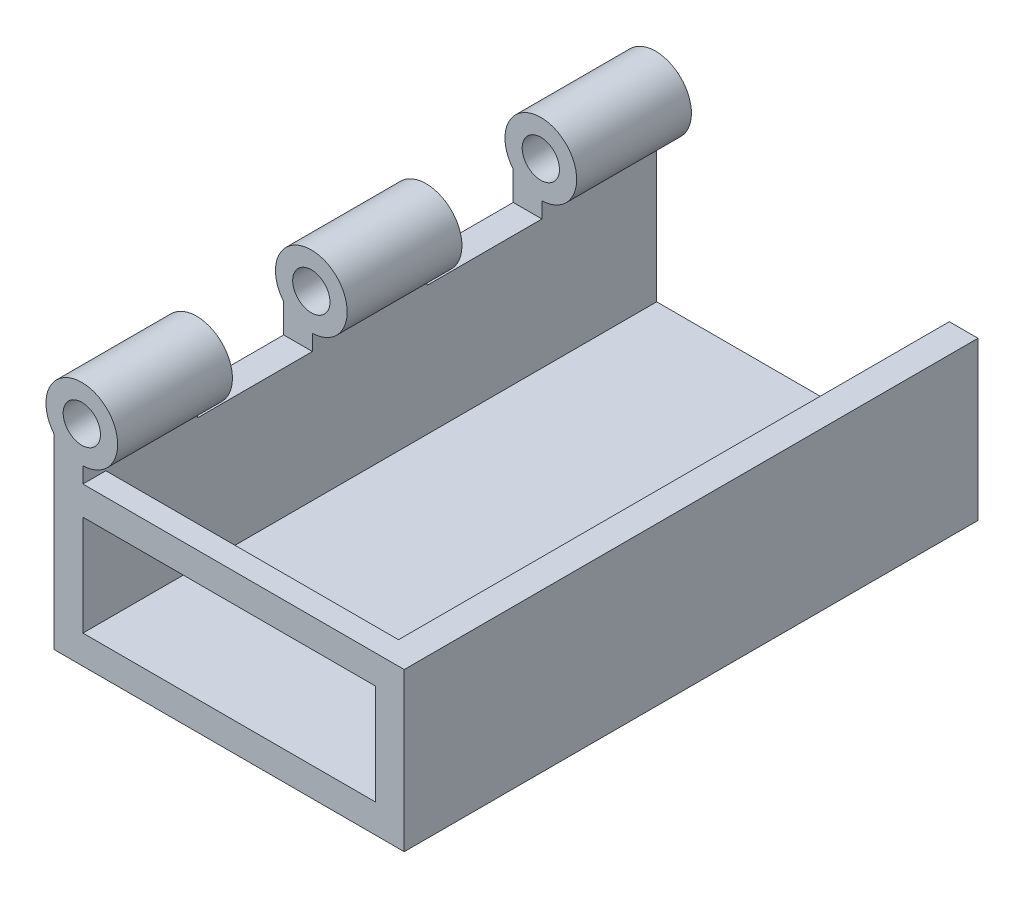
ISO-10303-21;
HEADER;
FILE_DESCRIPTION(('STEP AP214'),'2;1');
FILE_NAME('part.step','',(''),(''),'','','');
FILE_SCHEMA(('AUTOMOTIVE_DESIGN { 1 0 10303 214 1 1 1 1 }'));
ENDSEC;
DATA;
#1=APPLICATION_CONTEXT('core data for automotive mechanical design processes');
#2=APPLICATION_PROTOCOL_DEFINITION('international standard','automotive_design',2000,#1);
#3=PRODUCT_CONTEXT('',#1,'mechanical');
#4=PRODUCT('Part','Part','',(#3));
#5=PRODUCT_RELATED_PRODUCT_CATEGORY('part','',(#4));
#6=PRODUCT_DEFINITION_FORMATION('','',#4);
#7=PRODUCT_DEFINITION_CONTEXT('part definition',#1,'design');
#8=PRODUCT_DEFINITION('design','',#6,#7);
#9=PRODUCT_DEFINITION_SHAPE('','',#8);
#10=(LENGTH_UNIT() NAMED_UNIT(*) SI_UNIT(.MILLI.,.METRE.));
#11=(NAMED_UNIT(*) PLANE_ANGLE_UNIT() SI_UNIT($,.RADIAN.));
#12=(NAMED_UNIT(*) SI_UNIT($,.STERADIAN.) SOLID_ANGLE_UNIT());
#13=UNCERTAINTY_MEASURE_WITH_UNIT(LENGTH_MEASURE(1.E-05),#10,'distance_accuracy_value','');
#14=(GEOMETRIC_REPRESENTATION_CONTEXT(3) GLOBAL_UNCERTAINTY_ASSIGNED_CONTEXT((#13)) GLOBAL_UNIT_ASSIGNED_CONTEXT((#10,
#11,#12)) REPRESENTATION_CONTEXT('',''));
#15=CARTESIAN_POINT('',(0.,0.,0.));
#16=DIRECTION('',(0.,0.,1.));
#17=DIRECTION('',(1.,0.,0.));
#18=AXIS2_PLACEMENT_3D('',#15,#16,#17);
#19=CARTESIAN_POINT('',(0.,13.97,0.));
#20=DIRECTION('',(0.,1.,0.));
#21=DIRECTION('',(0.,0.,1.));
#22=AXIS2_PLACEMENT_3D('',#19,#20,#21);
#23=PLANE('',#22);
#24=DIRECTION('',(-1.,0.,0.));
#25=VECTOR('',#24,1.);
#26=CARTESIAN_POINT('',(0.,13.97,-14.224));
#27=LINE('',#26,#25);
#28=CARTESIAN_POINT('',(-12.954,13.97,-14.224));
#29=VERTEX_POINT('',#28);
#30=CARTESIAN_POINT('',(-15.494,13.97,-14.224));
#31=VERTEX_POINT('',#30);
#32=EDGE_CURVE('E214',#29,#31,#27,.T.);
#33=ORIENTED_EDGE('',*,*,#32,.T.);
#34=DIRECTION('',(0.,0.,1.));
#35=VECTOR('',#34,1.);
#36=CARTESIAN_POINT('',(-15.494,13.97,0.));
#37=LINE('',#36,#35);
#38=CARTESIAN_POINT('',(-15.494,13.97,-4.06400000000001));
#39=VERTEX_POINT('',#38);
#40=EDGE_CURVE('E363',#31,#39,#37,.T.);
#41=ORIENTED_EDGE('',*,*,#40,.T.);
#42=DIRECTION('',(-1.,0.,0.));
#43=VECTOR('',#42,1.);
#44=CARTESIAN_POINT('',(0.,13.97,-4.06400000000001));
#45=LINE('',#44,#43);
#46=CARTESIAN_POINT('',(-12.954,13.97,-4.06400000000001));
#47=VERTEX_POINT('',#46);
#48=EDGE_CURVE('E243',#47,#39,#45,.T.);
#49=ORIENTED_EDGE('',*,*,#48,.F.);
#50=DIRECTION('',(0.,0.,1.));
#51=VECTOR('',#50,1.);
#52=CARTESIAN_POINT('',(-12.954,13.97,0.));
#53=LINE('',#52,#51);
#54=EDGE_CURVE('E58',#29,#47,#53,.T.);
#55=ORIENTED_EDGE('',*,*,#54,.F.);
#56=EDGE_LOOP('',(#33,#41,#49,#55));
#57=FACE_BOUND('',#56,.T.);
#58=ADVANCED_FACE('F41',(#57),#23,.T.);
#59=DIRECTION('',(1.,0.,0.));
#60=VECTOR('',#59,1.);
#61=CARTESIAN_POINT('',(0.,13.97,24.384));
#62=LINE('',#61,#60);
#63=CARTESIAN_POINT('',(-12.954,13.97,24.384));
#64=VERTEX_POINT('',#63);
#65=CARTESIAN_POINT('',(12.954,13.97,24.384));
#66=VERTEX_POINT('',#65);
#67=EDGE_CURVE('E355',#64,#66,#62,.T.);
#68=ORIENTED_EDGE('',*,*,#67,.F.);
#69=DIRECTION('',(0.,0.,1.));
#70=VECTOR('',#69,1.);
#71=CARTESIAN_POINT('',(-12.954,13.97,16.256));
#72=LINE('',#71,#70);
#73=CARTESIAN_POINT('',(-12.954,13.97,26.416));
#74=VERTEX_POINT('',#73);
#75=EDGE_CURVE('E11',#64,#74,#72,.T.);
#76=ORIENTED_EDGE('',*,*,#75,.T.);
#77=DIRECTION('',(1.,0.,0.));
#78=VECTOR('',#77,1.);
#79=CARTESIAN_POINT('',(0.,13.97,26.416));
#80=LINE('',#79,#78);
#81=CARTESIAN_POINT('',(15.494,13.97,26.416));
#82=VERTEX_POINT('',#81);
#83=EDGE_CURVE('E366',#74,#82,#80,.T.);
#84=ORIENTED_EDGE('',*,*,#83,.T.);
#85=DIRECTION('',(0.,0.,-1.));
#86=VECTOR('',#85,1.);
#87=CARTESIAN_POINT('',(15.494,13.97,0.));
#88=LINE('',#87,#86);
#89=CARTESIAN_POINT('',(15.494,13.97,-24.384));
#90=VERTEX_POINT('',#89);
#91=EDGE_CURVE('E344',#82,#90,#88,.T.);
#92=ORIENTED_EDGE('',*,*,#91,.T.);
#93=DIRECTION('',(-1.,0.,0.));
#94=VECTOR('',#93,1.);
#95=CARTESIAN_POINT('',(0.,13.97,-24.384));
#96=LINE('',#95,#94);
#97=CARTESIAN_POINT('',(12.954,13.97,-24.384));
#98=VERTEX_POINT('',#97);
#99=EDGE_CURVE('E348',#90,#98,#96,.T.);
#100=ORIENTED_EDGE('',*,*,#99,.T.);
#101=DIRECTION('',(0.,0.,1.));
#102=VECTOR('',#101,1.);
#103=CARTESIAN_POINT('',(12.954,13.97,0.));
#104=LINE('',#103,#102);
#105=EDGE_CURVE('E352',#98,#66,#104,.T.);
#106=ORIENTED_EDGE('',*,*,#105,.T.);
#107=EDGE_LOOP('',(#68,#76,#84,#92,#100,#106));
#108=FACE_BOUND('',#107,.T.);
#109=ADVANCED_FACE('F465',(#108),#23,.T.);
#110=CARTESIAN_POINT('',(12.954,13.97,0.));
#111=DIRECTION('',(1.,0.,0.));
#112=DIRECTION('',(0.,0.,-1.));
#113=AXIS2_PLACEMENT_3D('',#110,#111,#112);
#114=PLANE('',#113);
#115=DIRECTION('',(0.,0.,1.));
#116=VECTOR('',#115,1.);
#117=CARTESIAN_POINT('',(12.954,11.43,23.876));
#118=LINE('',#117,#116);
#119=CARTESIAN_POINT('',(12.954,11.43,24.384));
#120=VERTEX_POINT('',#119);
#121=CARTESIAN_POINT('',(12.954,11.43,26.416));
#122=VERTEX_POINT('',#121);
#123=EDGE_CURVE('E325',#120,#122,#118,.T.);
#124=ORIENTED_EDGE('',*,*,#123,.F.);
#125=DIRECTION('',(0.,-1.,0.));
#126=VECTOR('',#125,1.);
#127=CARTESIAN_POINT('',(12.954,13.97,24.384));
#128=LINE('',#127,#126);
#129=EDGE_CURVE('E392',#66,#120,#128,.T.);
#130=ORIENTED_EDGE('',*,*,#129,.F.);
#131=ORIENTED_EDGE('',*,*,#105,.F.);
#132=DIRECTION('',(0.,-1.,0.));
#133=VECTOR('',#132,1.);
#134=CARTESIAN_POINT('',(12.954,13.97,-24.384));
#135=LINE('',#134,#133);
#136=CARTESIAN_POINT('',(12.954,2.54,-24.384));
#137=VERTEX_POINT('',#136);
#138=EDGE_CURVE('E395',#98,#137,#135,.T.);
#139=ORIENTED_EDGE('',*,*,#138,.T.);
#140=DIRECTION('',(0.,0.,1.));
#141=VECTOR('',#140,1.);
#142=CARTESIAN_POINT('',(12.954,2.54,-24.384));
#143=LINE('',#142,#141);
#144=CARTESIAN_POINT('',(12.954,2.54,26.416));
#145=VERTEX_POINT('',#144);
#146=EDGE_CURVE('E338',#137,#145,#143,.T.);
#147=ORIENTED_EDGE('',*,*,#146,.T.);
#148=DIRECTION('',(0.,1.,0.));
#149=VECTOR('',#148,1.);
#150=CARTESIAN_POINT('',(12.954,11.43,26.416));
#151=LINE('',#150,#149);
#152=EDGE_CURVE('E309',#145,#122,#151,.T.);
#153=ORIENTED_EDGE('',*,*,#152,.T.);
#154=EDGE_LOOP('',(#124,#130,#131,#139,#147,#153));
#155=FACE_BOUND('',#154,.T.);
#156=ADVANCED_FACE('F472',(#155),#114,.F.);
#157=CARTESIAN_POINT('',(0.,13.97,24.384));
#158=DIRECTION('',(0.,0.,-1.));
#159=DIRECTION('',(-1.,0.,0.));
#160=AXIS2_PLACEMENT_3D('',#157,#158,#159);
#161=PLANE('',#160);
#162=DIRECTION('',(1.,0.,0.));
#163=VECTOR('',#162,1.);
#164=CARTESIAN_POINT('',(0.,11.43,24.384));
#165=LINE('',#164,#163);
#166=CARTESIAN_POINT('',(-12.954,11.43,24.384));
#167=VERTEX_POINT('',#166);
#168=EDGE_CURVE('E329',#167,#120,#165,.T.);
#169=ORIENTED_EDGE('',*,*,#168,.F.);
#170=DIRECTION('',(0.,-1.,0.));
#171=VECTOR('',#170,1.);
#172=CARTESIAN_POINT('',(-12.954,13.97,24.384));
#173=LINE('',#172,#171);
#174=EDGE_CURVE('E188',#64,#167,#173,.T.);
#175=ORIENTED_EDGE('',*,*,#174,.F.);
#176=ORIENTED_EDGE('',*,*,#67,.T.);
#177=ORIENTED_EDGE('',*,*,#129,.T.);
#178=EDGE_LOOP('',(#169,#175,#176,#177));
#179=FACE_BOUND('',#178,.T.);
#180=ADVANCED_FACE('F497',(#179),#161,.T.);
#181=CARTESIAN_POINT('',(-12.954,13.97,0.));
#182=DIRECTION('',(1.,0.,0.));
#183=DIRECTION('',(0.,0.,-1.));
#184=AXIS2_PLACEMENT_3D('',#181,#182,#183);
#185=PLANE('',#184);
#186=ORIENTED_EDGE('',*,*,#174,.T.);
#187=DIRECTION('',(0.,0.,1.));
#188=VECTOR('',#187,1.);
#189=CARTESIAN_POINT('',(-12.954,11.43,23.876));
#190=LINE('',#189,#188);
#191=CARTESIAN_POINT('',(-12.954,11.43,26.416));
#192=VERTEX_POINT('',#191);
#193=EDGE_CURVE('E326',#167,#192,#190,.T.);
#194=ORIENTED_EDGE('',*,*,#193,.T.);
#195=DIRECTION('',(0.,-1.,0.));
#196=VECTOR('',#195,1.);
#197=CARTESIAN_POINT('',(-12.954,11.43,26.416));
#198=LINE('',#197,#196);
#199=CARTESIAN_POINT('',(-12.954,2.54,26.416));
#200=VERTEX_POINT('',#199);
#201=EDGE_CURVE('E318',#192,#200,#198,.T.);
#202=ORIENTED_EDGE('',*,*,#201,.T.);
#203=DIRECTION('',(0.,0.,1.));
#204=VECTOR('',#203,1.);
#205=CARTESIAN_POINT('',(-12.954,2.54,-24.384));
#206=LINE('',#205,#204);
#207=CARTESIAN_POINT('',(-12.954,2.54,-24.384));
#208=VERTEX_POINT('',#207);
#209=EDGE_CURVE('E182',#208,#200,#206,.T.);
#210=ORIENTED_EDGE('',*,*,#209,.F.);
#211=DIRECTION('',(0.,-1.,0.));
#212=VECTOR('',#211,1.);
#213=CARTESIAN_POINT('',(-12.954,13.97,-24.384));
#214=LINE('',#213,#212);
#215=CARTESIAN_POINT('',(-12.954,15.3661408239153,-24.384));
#216=VERTEX_POINT('',#215);
#217=EDGE_CURVE('E174',#216,#208,#214,.T.);
#218=ORIENTED_EDGE('',*,*,#217,.F.);
#219=DIRECTION('',(0.,0.,1.));
#220=VECTOR('',#219,1.);
#221=CARTESIAN_POINT('',(-12.954,15.3661408239153,-24.384));
#222=LINE('',#221,#220);
#223=CARTESIAN_POINT('',(-12.954,15.3661408239153,-14.224));
#224=VERTEX_POINT('',#223);
#225=EDGE_CURVE('E179',#216,#224,#222,.T.);
#226=ORIENTED_EDGE('',*,*,#225,.T.);
#227=DIRECTION('',(0.,1.,0.));
#228=VECTOR('',#227,1.);
#229=CARTESIAN_POINT('',(-12.954,0.,-14.224));
#230=LINE('',#229,#228);
#231=EDGE_CURVE('E217',#29,#224,#230,.T.);
#232=ORIENTED_EDGE('',*,*,#231,.F.);
#233=ORIENTED_EDGE('',*,*,#54,.T.);
#234=DIRECTION('',(0.,1.,0.));
#235=VECTOR('',#234,1.);
#236=CARTESIAN_POINT('',(-12.954,0.,-4.06400000000001));
#237=LINE('',#236,#235);
#238=CARTESIAN_POINT('',(-12.954,15.3661408239153,-4.06400000000001));
#239=VERTEX_POINT('',#238);
#240=EDGE_CURVE('E231',#47,#239,#237,.T.);
#241=ORIENTED_EDGE('',*,*,#240,.T.);
#242=DIRECTION('',(0.,0.,1.));
#243=VECTOR('',#242,1.);
#244=CARTESIAN_POINT('',(-12.954,15.3661408239153,-4.06400000000001));
#245=LINE('',#244,#243);
#246=CARTESIAN_POINT('',(-12.954,15.3661408239153,6.09599999999999));
#247=VERTEX_POINT('',#246);
#248=EDGE_CURVE('E251',#239,#247,#245,.T.);
#249=ORIENTED_EDGE('',*,*,#248,.T.);
#250=DIRECTION('',(0.,1.,0.));
#251=VECTOR('',#250,1.);
#252=CARTESIAN_POINT('',(-12.954,0.,6.09599999999999));
#253=LINE('',#252,#251);
#254=CARTESIAN_POINT('',(-12.954,13.97,6.09599999999999));
#255=VERTEX_POINT('',#254);
#256=EDGE_CURVE('E229',#255,#247,#253,.T.);
#257=ORIENTED_EDGE('',*,*,#256,.F.);
#258=CARTESIAN_POINT('',(-12.954,13.97,16.256));
#259=VERTEX_POINT('',#258);
#260=EDGE_CURVE('E359',#255,#259,#53,.T.);
#261=ORIENTED_EDGE('',*,*,#260,.T.);
#262=DIRECTION('',(0.,1.,0.));
#263=VECTOR('',#262,1.);
#264=CARTESIAN_POINT('',(-12.954,0.,16.256));
#265=LINE('',#264,#263);
#266=CARTESIAN_POINT('',(-12.954,15.3661408239153,16.256));
#267=VERTEX_POINT('',#266);
#268=EDGE_CURVE('E274',#259,#267,#265,.T.);
#269=ORIENTED_EDGE('',*,*,#268,.T.);
#270=DIRECTION('',(0.,0.,1.));
#271=VECTOR('',#270,1.);
#272=CARTESIAN_POINT('',(-12.954,15.3661408239153,16.256));
#273=LINE('',#272,#271);
#274=CARTESIAN_POINT('',(-12.954,15.3661408239153,26.416));
#275=VERTEX_POINT('',#274);
#276=EDGE_CURVE('E294',#267,#275,#273,.T.);
#277=ORIENTED_EDGE('',*,*,#276,.T.);
#278=DIRECTION('',(0.,1.,0.));
#279=VECTOR('',#278,1.);
#280=CARTESIAN_POINT('',(-12.954,0.,26.416));
#281=LINE('',#280,#279);
#282=EDGE_CURVE('E271',#74,#275,#281,.T.);
#283=ORIENTED_EDGE('',*,*,#282,.F.);
#284=ORIENTED_EDGE('',*,*,#75,.F.);
#285=EDGE_LOOP('',(#186,#194,#202,#210,#218,#226,#232,#233,#241,#249,#257,#261,#269,#277,#283,#284));
#286=FACE_BOUND('',#285,.T.);
#287=ADVANCED_FACE('F177',(#286),#185,.T.);
#288=CARTESIAN_POINT('',(15.494,13.97,0.));
#289=DIRECTION('',(-1.,0.,0.));
#290=DIRECTION('',(0.,0.,1.));
#291=AXIS2_PLACEMENT_3D('',#288,#289,#290);
#292=PLANE('',#291);
#293=DIRECTION('',(0.,0.,-1.));
#294=VECTOR('',#293,1.);
#295=CARTESIAN_POINT('',(15.494,0.,0.));
#296=LINE('',#295,#294);
#297=CARTESIAN_POINT('',(15.494,0.,26.416));
#298=VERTEX_POINT('',#297);
#299=CARTESIAN_POINT('',(15.494,0.,-24.384));
#300=VERTEX_POINT('',#299);
#301=EDGE_CURVE('E343',#298,#300,#296,.T.);
#302=ORIENTED_EDGE('',*,*,#301,.T.);
#303=DIRECTION('',(0.,-1.,0.));
#304=VECTOR('',#303,1.);
#305=CARTESIAN_POINT('',(15.494,13.97,-24.384));
#306=LINE('',#305,#304);
#307=EDGE_CURVE('E45',#90,#300,#306,.T.);
#308=ORIENTED_EDGE('',*,*,#307,.F.);
#309=ORIENTED_EDGE('',*,*,#91,.F.);
#310=DIRECTION('',(0.,-1.,0.));
#311=VECTOR('',#310,1.);
#312=CARTESIAN_POINT('',(15.494,13.97,26.416));
#313=LINE('',#312,#311);
#314=EDGE_CURVE('E369',#82,#298,#313,.T.);
#315=ORIENTED_EDGE('',*,*,#314,.T.);
#316=EDGE_LOOP('',(#302,#308,#309,#315));
#317=FACE_BOUND('',#316,.T.);
#318=ADVANCED_FACE('F43',(#317),#292,.F.);
#319=CARTESIAN_POINT('',(0.,13.97,-24.384));
#320=DIRECTION('',(0.,0.,1.));
#321=DIRECTION('',(1.,0.,0.));
#322=AXIS2_PLACEMENT_3D('',#319,#320,#321);
#323=PLANE('',#322);
#324=DIRECTION('',(-1.,0.,0.));
#325=VECTOR('',#324,1.);
#326=CARTESIAN_POINT('',(0.,0.,-24.384));
#327=LINE('',#326,#325);
#328=CARTESIAN_POINT('',(-15.494,0.,-24.384));
#329=VERTEX_POINT('',#328);
#330=EDGE_CURVE('E373',#300,#329,#327,.T.);
#331=ORIENTED_EDGE('',*,*,#330,.T.);
#332=DIRECTION('',(0.,-1.,0.));
#333=VECTOR('',#332,1.);
#334=CARTESIAN_POINT('',(-15.494,13.97,-24.384));
#335=LINE('',#334,#333);
#336=CARTESIAN_POINT('',(-15.494,16.51,-24.384));
#337=VERTEX_POINT('',#336);
#338=EDGE_CURVE('E189',#337,#329,#335,.T.);
#339=ORIENTED_EDGE('',*,*,#338,.F.);
#340=CARTESIAN_POINT('',(-13.052425,18.5396148697167,-24.384));
#341=DIRECTION('',(0.,0.,1.));
#342=DIRECTION('',(1.,0.,0.));
#343=AXIS2_PLACEMENT_3D('',#340,#341,#342);
#344=CIRCLE('',#343,3.175);
#345=EDGE_CURVE('E194',#216,#337,#344,.T.);
#346=ORIENTED_EDGE('',*,*,#345,.F.);
#347=ORIENTED_EDGE('',*,*,#217,.T.);
#348=DIRECTION('',(1.,0.,0.));
#349=VECTOR('',#348,1.);
#350=CARTESIAN_POINT('',(-12.954,2.54,-24.384));
#351=LINE('',#350,#349);
#352=EDGE_CURVE('E335',#208,#137,#351,.T.);
#353=ORIENTED_EDGE('',*,*,#352,.T.);
#354=ORIENTED_EDGE('',*,*,#138,.F.);
#355=ORIENTED_EDGE('',*,*,#99,.F.);
#356=ORIENTED_EDGE('',*,*,#307,.T.);
#357=EDGE_LOOP('',(#331,#339,#346,#347,#353,#354,#355,#356));
#358=FACE_BOUND('',#357,.T.);
#359=CARTESIAN_POINT('',(-13.052425,18.5396148697167,-24.384));
#360=DIRECTION('',(0.,0.,1.));
#361=DIRECTION('',(1.,0.,0.));
#362=AXIS2_PLACEMENT_3D('',#359,#360,#361);
#363=CIRCLE('',#362,1.651);
#364=CARTESIAN_POINT('',(-11.401425,18.5396148697167,-24.384));
#365=VERTEX_POINT('',#364);
#366=EDGE_CURVE('E200',#365,#365,#363,.T.);
#367=ORIENTED_EDGE('',*,*,#366,.T.);
#368=EDGE_LOOP('',(#367));
#369=FACE_BOUND('',#368,.T.);
#370=ADVANCED_FACE('F202',(#358,#369),#323,.F.);
#371=CARTESIAN_POINT('',(-15.494,13.97,0.));
#372=DIRECTION('',(1.,0.,0.));
#373=DIRECTION('',(0.,0.,-1.));
#374=AXIS2_PLACEMENT_3D('',#371,#372,#373);
#375=PLANE('',#374);
#376=DIRECTION('',(0.,0.,1.));
#377=VECTOR('',#376,1.);
#378=CARTESIAN_POINT('',(-15.494,0.,0.));
#379=LINE('',#378,#377);
#380=CARTESIAN_POINT('',(-15.494,0.,26.416));
#381=VERTEX_POINT('',#380);
#382=EDGE_CURVE('E376',#329,#381,#379,.T.);
#383=ORIENTED_EDGE('',*,*,#382,.T.);
#384=DIRECTION('',(0.,-1.,0.));
#385=VECTOR('',#384,1.);
#386=CARTESIAN_POINT('',(-15.494,13.97,26.416));
#387=LINE('',#386,#385);
#388=CARTESIAN_POINT('',(-15.494,16.51,26.416));
#389=VERTEX_POINT('',#388);
#390=EDGE_CURVE('E384',#389,#381,#387,.T.);
#391=ORIENTED_EDGE('',*,*,#390,.F.);
#392=DIRECTION('',(0.,0.,1.));
#393=VECTOR('',#392,1.);
#394=CARTESIAN_POINT('',(-15.494,16.51,16.256));
#395=LINE('',#394,#393);
#396=CARTESIAN_POINT('',(-15.494,16.51,16.256));
#397=VERTEX_POINT('',#396);
#398=EDGE_CURVE('E305',#397,#389,#395,.T.);
#399=ORIENTED_EDGE('',*,*,#398,.F.);
#400=DIRECTION('',(0.,1.,0.));
#401=VECTOR('',#400,1.);
#402=CARTESIAN_POINT('',(-15.494,0.,16.256));
#403=LINE('',#402,#401);
#404=CARTESIAN_POINT('',(-15.494,13.97,16.256));
#405=VERTEX_POINT('',#404);
#406=EDGE_CURVE('E283',#405,#397,#403,.T.);
#407=ORIENTED_EDGE('',*,*,#406,.F.);
#408=CARTESIAN_POINT('',(-15.494,13.97,6.09599999999999));
#409=VERTEX_POINT('',#408);
#410=EDGE_CURVE('E362',#409,#405,#37,.T.);
#411=ORIENTED_EDGE('',*,*,#410,.F.);
#412=DIRECTION('',(0.,1.,0.));
#413=VECTOR('',#412,1.);
#414=CARTESIAN_POINT('',(-15.494,0.,6.09599999999999));
#415=LINE('',#414,#413);
#416=CARTESIAN_POINT('',(-15.494,16.51,6.09599999999999));
#417=VERTEX_POINT('',#416);
#418=EDGE_CURVE('E259',#409,#417,#415,.T.);
#419=ORIENTED_EDGE('',*,*,#418,.T.);
#420=DIRECTION('',(0.,0.,1.));
#421=VECTOR('',#420,1.);
#422=CARTESIAN_POINT('',(-15.494,16.51,-4.06400000000001));
#423=LINE('',#422,#421);
#424=CARTESIAN_POINT('',(-15.494,16.51,-4.06400000000001));
#425=VERTEX_POINT('',#424);
#426=EDGE_CURVE('E268',#425,#417,#423,.T.);
#427=ORIENTED_EDGE('',*,*,#426,.F.);
#428=DIRECTION('',(0.,1.,0.));
#429=VECTOR('',#428,1.);
#430=CARTESIAN_POINT('',(-15.494,0.,-4.06400000000001));
#431=LINE('',#430,#429);
#432=EDGE_CURVE('E240',#39,#425,#431,.T.);
#433=ORIENTED_EDGE('',*,*,#432,.F.);
#434=ORIENTED_EDGE('',*,*,#40,.F.);
#435=DIRECTION('',(0.,1.,0.));
#436=VECTOR('',#435,1.);
#437=CARTESIAN_POINT('',(-15.494,0.,-14.224));
#438=LINE('',#437,#436);
#439=CARTESIAN_POINT('',(-15.494,16.51,-14.224));
#440=VERTEX_POINT('',#439);
#441=EDGE_CURVE('E222',#31,#440,#438,.T.);
#442=ORIENTED_EDGE('',*,*,#441,.T.);
#443=DIRECTION('',(0.,0.,1.));
#444=VECTOR('',#443,1.);
#445=CARTESIAN_POINT('',(-15.494,16.51,-24.384));
#446=LINE('',#445,#444);
#447=EDGE_CURVE('E199',#337,#440,#446,.T.);
#448=ORIENTED_EDGE('',*,*,#447,.F.);
#449=ORIENTED_EDGE('',*,*,#338,.T.);
#450=EDGE_LOOP('',(#383,#391,#399,#407,#411,#419,#427,#433,#434,#442,#448,#449));
#451=FACE_BOUND('',#450,.T.);
#452=ADVANCED_FACE('F413',(#451),#375,.F.);
#453=CARTESIAN_POINT('',(0.,13.97,26.416));
#454=DIRECTION('',(0.,0.,-1.));
#455=DIRECTION('',(-1.,0.,0.));
#456=AXIS2_PLACEMENT_3D('',#453,#454,#455);
#457=PLANE('',#456);
#458=DIRECTION('',(-1.,0.,0.));
#459=VECTOR('',#458,1.);
#460=CARTESIAN_POINT('',(-12.954,11.43,26.416));
#461=LINE('',#460,#459);
#462=EDGE_CURVE('E314',#122,#192,#461,.T.);
#463=ORIENTED_EDGE('',*,*,#462,.F.);
#464=ORIENTED_EDGE('',*,*,#152,.F.);
#465=DIRECTION('',(1.,0.,0.));
#466=VECTOR('',#465,1.);
#467=CARTESIAN_POINT('',(-12.954,2.54,26.416));
#468=LINE('',#467,#466);
#469=EDGE_CURVE('E321',#200,#145,#468,.T.);
#470=ORIENTED_EDGE('',*,*,#469,.F.);
#471=ORIENTED_EDGE('',*,*,#201,.F.);
#472=EDGE_LOOP('',(#463,#464,#470,#471));
#473=FACE_BOUND('',#472,.T.);
#474=DIRECTION('',(1.,0.,0.));
#475=VECTOR('',#474,1.);
#476=CARTESIAN_POINT('',(0.,0.,26.416));
#477=LINE('',#476,#475);
#478=EDGE_CURVE('E349',#381,#298,#477,.T.);
#479=ORIENTED_EDGE('',*,*,#478,.T.);
#480=ORIENTED_EDGE('',*,*,#314,.F.);
#481=ORIENTED_EDGE('',*,*,#83,.F.);
#482=ORIENTED_EDGE('',*,*,#282,.T.);
#483=CARTESIAN_POINT('',(-13.052425,18.5396148697167,26.416));
#484=DIRECTION('',(0.,0.,1.));
#485=DIRECTION('',(1.,0.,0.));
#486=AXIS2_PLACEMENT_3D('',#483,#484,#485);
#487=CIRCLE('',#486,3.175);
#488=EDGE_CURVE('E298',#275,#389,#487,.T.);
#489=ORIENTED_EDGE('',*,*,#488,.T.);
#490=ORIENTED_EDGE('',*,*,#390,.T.);
#491=EDGE_LOOP('',(#479,#480,#481,#482,#489,#490));
#492=FACE_BOUND('',#491,.T.);
#493=CARTESIAN_POINT('',(-13.052425,18.5396148697167,26.416));
#494=DIRECTION('',(0.,0.,1.));
#495=DIRECTION('',(1.,0.,0.));
#496=AXIS2_PLACEMENT_3D('',#493,#494,#495);
#497=CIRCLE('',#496,1.651);
#498=CARTESIAN_POINT('',(-11.401425,18.5396148697167,26.416));
#499=VERTEX_POINT('',#498);
#500=EDGE_CURVE('E279',#499,#499,#497,.T.);
#501=ORIENTED_EDGE('',*,*,#500,.F.);
#502=EDGE_LOOP('',(#501));
#503=FACE_BOUND('',#502,.T.);
#504=ADVANCED_FACE('F416',(#473,#492,#503),#457,.F.);
#505=DIRECTION('',(-1.,0.,0.));
#506=VECTOR('',#505,1.);
#507=CARTESIAN_POINT('',(0.,13.97,6.09599999999999));
#508=LINE('',#507,#506);
#509=EDGE_CURVE('E66',#255,#409,#508,.T.);
#510=ORIENTED_EDGE('',*,*,#509,.T.);
#511=ORIENTED_EDGE('',*,*,#410,.T.);
#512=DIRECTION('',(-1.,0.,0.));
#513=VECTOR('',#512,1.);
#514=CARTESIAN_POINT('',(0.,13.97,16.256));
#515=LINE('',#514,#513);
#516=EDGE_CURVE('E286',#259,#405,#515,.T.);
#517=ORIENTED_EDGE('',*,*,#516,.F.);
#518=ORIENTED_EDGE('',*,*,#260,.F.);
#519=EDGE_LOOP('',(#510,#511,#517,#518));
#520=FACE_BOUND('',#519,.T.);
#521=ADVANCED_FACE('F430',(#520),#23,.T.);
#522=CARTESIAN_POINT('',(0.,0.,0.));
#523=DIRECTION('',(0.,1.,0.));
#524=DIRECTION('',(0.,0.,1.));
#525=AXIS2_PLACEMENT_3D('',#522,#523,#524);
#526=PLANE('',#525);
#527=ORIENTED_EDGE('',*,*,#301,.F.);
#528=ORIENTED_EDGE('',*,*,#478,.F.);
#529=ORIENTED_EDGE('',*,*,#382,.F.);
#530=ORIENTED_EDGE('',*,*,#330,.F.);
#531=EDGE_LOOP('',(#527,#528,#529,#530));
#532=FACE_BOUND('',#531,.T.);
#533=ADVANCED_FACE('F410',(#532),#526,.F.);
#534=CARTESIAN_POINT('',(0.,2.54,0.));
#535=DIRECTION('',(0.,-1.,0.));
#536=DIRECTION('',(0.,0.,-1.));
#537=AXIS2_PLACEMENT_3D('',#534,#535,#536);
#538=PLANE('',#537);
#539=ORIENTED_EDGE('',*,*,#469,.T.);
#540=ORIENTED_EDGE('',*,*,#146,.F.);
#541=ORIENTED_EDGE('',*,*,#352,.F.);
#542=ORIENTED_EDGE('',*,*,#209,.T.);
#543=EDGE_LOOP('',(#539,#540,#541,#542));
#544=FACE_BOUND('',#543,.T.);
#545=ADVANCED_FACE('F482',(#544),#538,.F.);
#546=CARTESIAN_POINT('',(-12.954,11.43,23.876));
#547=DIRECTION('',(0.,1.,0.));
#548=DIRECTION('',(0.,0.,1.));
#549=AXIS2_PLACEMENT_3D('',#546,#547,#548);
#550=PLANE('',#549);
#551=ORIENTED_EDGE('',*,*,#168,.T.);
#552=ORIENTED_EDGE('',*,*,#123,.T.);
#553=ORIENTED_EDGE('',*,*,#462,.T.);
#554=ORIENTED_EDGE('',*,*,#193,.F.);
#555=EDGE_LOOP('',(#551,#552,#553,#554));
#556=FACE_BOUND('',#555,.T.);
#557=ADVANCED_FACE('F514',(#556),#550,.F.);
#558=CARTESIAN_POINT('',(-13.052425,18.5396148697167,16.256));
#559=DIRECTION('',(0.,0.,1.));
#560=DIRECTION('',(1.,0.,0.));
#561=AXIS2_PLACEMENT_3D('',#558,#559,#560);
#562=CYLINDRICAL_SURFACE('',#561,3.175);
#563=ORIENTED_EDGE('',*,*,#488,.F.);
#564=ORIENTED_EDGE('',*,*,#276,.F.);
#565=CARTESIAN_POINT('',(-13.052425,18.5396148697167,16.256));
#566=DIRECTION('',(0.,0.,1.));
#567=DIRECTION('',(1.,0.,0.));
#568=AXIS2_PLACEMENT_3D('',#565,#566,#567);
#569=CIRCLE('',#568,3.175);
#570=EDGE_CURVE('E278',#267,#397,#569,.T.);
#571=ORIENTED_EDGE('',*,*,#570,.T.);
#572=ORIENTED_EDGE('',*,*,#398,.T.);
#573=EDGE_LOOP('',(#563,#564,#571,#572));
#574=FACE_BOUND('',#573,.T.);
#575=ADVANCED_FACE('F421',(#574),#562,.T.);
#576=CARTESIAN_POINT('',(-13.052425,18.5396148697167,16.256));
#577=DIRECTION('',(0.,0.,1.));
#578=DIRECTION('',(1.,0.,0.));
#579=AXIS2_PLACEMENT_3D('',#576,#577,#578);
#580=CYLINDRICAL_SURFACE('',#579,1.651);
#581=CARTESIAN_POINT('',(-13.052425,18.5396148697167,16.256));
#582=DIRECTION('',(0.,0.,1.));
#583=DIRECTION('',(1.,0.,0.));
#584=AXIS2_PLACEMENT_3D('',#581,#582,#583);
#585=CIRCLE('',#584,1.651);
#586=CARTESIAN_POINT('',(-11.401425,18.5396148697167,16.256));
#587=VERTEX_POINT('',#586);
#588=EDGE_CURVE('E290',#587,#587,#585,.T.);
#589=ORIENTED_EDGE('',*,*,#588,.F.);
#590=EDGE_LOOP('',(#589));
#591=FACE_BOUND('',#590,.T.);
#592=ORIENTED_EDGE('',*,*,#500,.T.);
#593=EDGE_LOOP('',(#592));
#594=FACE_BOUND('',#593,.T.);
#595=ADVANCED_FACE('F521',(#591,#594),#580,.F.);
#596=CARTESIAN_POINT('',(0.,0.,16.256));
#597=DIRECTION('',(0.,0.,1.));
#598=DIRECTION('',(1.,0.,0.));
#599=AXIS2_PLACEMENT_3D('',#596,#597,#598);
#600=PLANE('',#599);
#601=ORIENTED_EDGE('',*,*,#268,.F.);
#602=ORIENTED_EDGE('',*,*,#516,.T.);
#603=ORIENTED_EDGE('',*,*,#406,.T.);
#604=ORIENTED_EDGE('',*,*,#570,.F.);
#605=EDGE_LOOP('',(#601,#602,#603,#604));
#606=FACE_BOUND('',#605,.T.);
#607=ORIENTED_EDGE('',*,*,#588,.T.);
#608=EDGE_LOOP('',(#607));
#609=FACE_BOUND('',#608,.T.);
#610=ADVANCED_FACE('F427',(#606,#609),#600,.F.);
#611=CARTESIAN_POINT('',(-13.052425,18.5396148697167,-4.06400000000001));
#612=DIRECTION('',(0.,0.,1.));
#613=DIRECTION('',(1.,0.,0.));
#614=AXIS2_PLACEMENT_3D('',#611,#612,#613);
#615=CYLINDRICAL_SURFACE('',#614,3.175);
#616=CARTESIAN_POINT('',(-13.052425,18.5396148697167,6.09599999999999));
#617=DIRECTION('',(0.,0.,1.));
#618=DIRECTION('',(1.,0.,0.));
#619=AXIS2_PLACEMENT_3D('',#616,#617,#618);
#620=CIRCLE('',#619,3.175);
#621=EDGE_CURVE('E255',#247,#417,#620,.T.);
#622=ORIENTED_EDGE('',*,*,#621,.F.);
#623=ORIENTED_EDGE('',*,*,#248,.F.);
#624=CARTESIAN_POINT('',(-13.052425,18.5396148697167,-4.06400000000001));
#625=DIRECTION('',(0.,0.,1.));
#626=DIRECTION('',(1.,0.,0.));
#627=AXIS2_PLACEMENT_3D('',#624,#625,#626);
#628=CIRCLE('',#627,3.175);
#629=EDGE_CURVE('E235',#239,#425,#628,.T.);
#630=ORIENTED_EDGE('',*,*,#629,.T.);
#631=ORIENTED_EDGE('',*,*,#426,.T.);
#632=EDGE_LOOP('',(#622,#623,#630,#631));
#633=FACE_BOUND('',#632,.T.);
#634=ADVANCED_FACE('F442',(#633),#615,.T.);
#635=CARTESIAN_POINT('',(-13.052425,18.5396148697167,-4.06400000000001));
#636=DIRECTION('',(0.,0.,1.));
#637=DIRECTION('',(1.,0.,0.));
#638=AXIS2_PLACEMENT_3D('',#635,#636,#637);
#639=CYLINDRICAL_SURFACE('',#638,1.651);
#640=CARTESIAN_POINT('',(-13.052425,18.5396148697167,-4.06400000000001));
#641=DIRECTION('',(0.,0.,1.));
#642=DIRECTION('',(1.,0.,0.));
#643=AXIS2_PLACEMENT_3D('',#640,#641,#642);
#644=CIRCLE('',#643,1.651);
#645=CARTESIAN_POINT('',(-11.401425,18.5396148697167,-4.06400000000001));
#646=VERTEX_POINT('',#645);
#647=EDGE_CURVE('E247',#646,#646,#644,.T.);
#648=ORIENTED_EDGE('',*,*,#647,.F.);
#649=EDGE_LOOP('',(#648));
#650=FACE_BOUND('',#649,.T.);
#651=CARTESIAN_POINT('',(-13.052425,18.5396148697167,6.09599999999999));
#652=DIRECTION('',(0.,0.,1.));
#653=DIRECTION('',(1.,0.,0.));
#654=AXIS2_PLACEMENT_3D('',#651,#652,#653);
#655=CIRCLE('',#654,1.651);
#656=CARTESIAN_POINT('',(-11.401425,18.5396148697167,6.09599999999999));
#657=VERTEX_POINT('',#656);
#658=EDGE_CURVE('E236',#657,#657,#655,.T.);
#659=ORIENTED_EDGE('',*,*,#658,.T.);
#660=EDGE_LOOP('',(#659));
#661=FACE_BOUND('',#660,.T.);
#662=ADVANCED_FACE('F531',(#650,#661),#639,.F.);
#663=CARTESIAN_POINT('',(0.,0.,-4.06400000000001));
#664=DIRECTION('',(0.,0.,1.));
#665=DIRECTION('',(1.,0.,0.));
#666=AXIS2_PLACEMENT_3D('',#663,#664,#665);
#667=PLANE('',#666);
#668=ORIENTED_EDGE('',*,*,#240,.F.);
#669=ORIENTED_EDGE('',*,*,#48,.T.);
#670=ORIENTED_EDGE('',*,*,#432,.T.);
#671=ORIENTED_EDGE('',*,*,#629,.F.);
#672=EDGE_LOOP('',(#668,#669,#670,#671));
#673=FACE_BOUND('',#672,.T.);
#674=ORIENTED_EDGE('',*,*,#647,.T.);
#675=EDGE_LOOP('',(#674));
#676=FACE_BOUND('',#675,.T.);
#677=ADVANCED_FACE('F445',(#673,#676),#667,.F.);
#678=CARTESIAN_POINT('',(0.,0.,6.09599999999999));
#679=DIRECTION('',(0.,0.,1.));
#680=DIRECTION('',(1.,0.,0.));
#681=AXIS2_PLACEMENT_3D('',#678,#679,#680);
#682=PLANE('',#681);
#683=ORIENTED_EDGE('',*,*,#256,.T.);
#684=ORIENTED_EDGE('',*,*,#621,.T.);
#685=ORIENTED_EDGE('',*,*,#418,.F.);
#686=ORIENTED_EDGE('',*,*,#509,.F.);
#687=EDGE_LOOP('',(#683,#684,#685,#686));
#688=FACE_BOUND('',#687,.T.);
#689=ORIENTED_EDGE('',*,*,#658,.F.);
#690=EDGE_LOOP('',(#689));
#691=FACE_BOUND('',#690,.T.);
#692=ADVANCED_FACE('F436',(#688,#691),#682,.T.);
#693=CARTESIAN_POINT('',(-13.052425,18.5396148697167,-24.384));
#694=DIRECTION('',(0.,0.,1.));
#695=DIRECTION('',(1.,0.,0.));
#696=AXIS2_PLACEMENT_3D('',#693,#694,#695);
#697=CYLINDRICAL_SURFACE('',#696,3.175);
#698=CARTESIAN_POINT('',(-13.052425,18.5396148697167,-14.224));
#699=DIRECTION('',(0.,0.,1.));
#700=DIRECTION('',(1.,0.,0.));
#701=AXIS2_PLACEMENT_3D('',#698,#699,#700);
#702=CIRCLE('',#701,3.175);
#703=EDGE_CURVE('E196',#224,#440,#702,.T.);
#704=ORIENTED_EDGE('',*,*,#703,.F.);
#705=ORIENTED_EDGE('',*,*,#225,.F.);
#706=ORIENTED_EDGE('',*,*,#345,.T.);
#707=ORIENTED_EDGE('',*,*,#447,.T.);
#708=EDGE_LOOP('',(#704,#705,#706,#707));
#709=FACE_BOUND('',#708,.T.);
#710=ADVANCED_FACE('F193',(#709),#697,.T.);
#711=CARTESIAN_POINT('',(-13.052425,18.5396148697167,-24.384));
#712=DIRECTION('',(0.,0.,1.));
#713=DIRECTION('',(1.,0.,0.));
#714=AXIS2_PLACEMENT_3D('',#711,#712,#713);
#715=CYLINDRICAL_SURFACE('',#714,1.651);
#716=ORIENTED_EDGE('',*,*,#366,.F.);
#717=EDGE_LOOP('',(#716));
#718=FACE_BOUND('',#717,.T.);
#719=CARTESIAN_POINT('',(-13.052425,18.5396148697167,-14.224));
#720=DIRECTION('',(0.,0.,1.));
#721=DIRECTION('',(1.,0.,0.));
#722=AXIS2_PLACEMENT_3D('',#719,#720,#721);
#723=CIRCLE('',#722,1.651);
#724=CARTESIAN_POINT('',(-11.401425,18.5396148697167,-14.224));
#725=VERTEX_POINT('',#724);
#726=EDGE_CURVE('E207',#725,#725,#723,.T.);
#727=ORIENTED_EDGE('',*,*,#726,.T.);
#728=EDGE_LOOP('',(#727));
#729=FACE_BOUND('',#728,.T.);
#730=ADVANCED_FACE('F452',(#718,#729),#715,.F.);
#731=CARTESIAN_POINT('',(0.,0.,-14.224));
#732=DIRECTION('',(0.,0.,1.));
#733=DIRECTION('',(1.,0.,0.));
#734=AXIS2_PLACEMENT_3D('',#731,#732,#733);
#735=PLANE('',#734);
#736=ORIENTED_EDGE('',*,*,#231,.T.);
#737=ORIENTED_EDGE('',*,*,#703,.T.);
#738=ORIENTED_EDGE('',*,*,#441,.F.);
#739=ORIENTED_EDGE('',*,*,#32,.F.);
#740=EDGE_LOOP('',(#736,#737,#738,#739));
#741=FACE_BOUND('',#740,.T.);
#742=ORIENTED_EDGE('',*,*,#726,.F.);
#743=EDGE_LOOP('',(#742));
#744=FACE_BOUND('',#743,.T.);
#745=ADVANCED_FACE('F449',(#741,#744),#735,.T.);
#746=CLOSED_SHELL('',(#58,#109,#156,#180,#287,#318,#370,#452,#504,#521,#533,#545,#557,#575,#595,
#610,#634,#662,#677,#692,#710,#730,#745));
#747=MANIFOLD_SOLID_BREP('B2',#746);
#748=ADVANCED_BREP_SHAPE_REPRESENTATION('',(#18,#747),#14);
#749=SHAPE_DEFINITION_REPRESENTATION(#9,#748);
ENDSEC;
END-ISO-10303-21;
